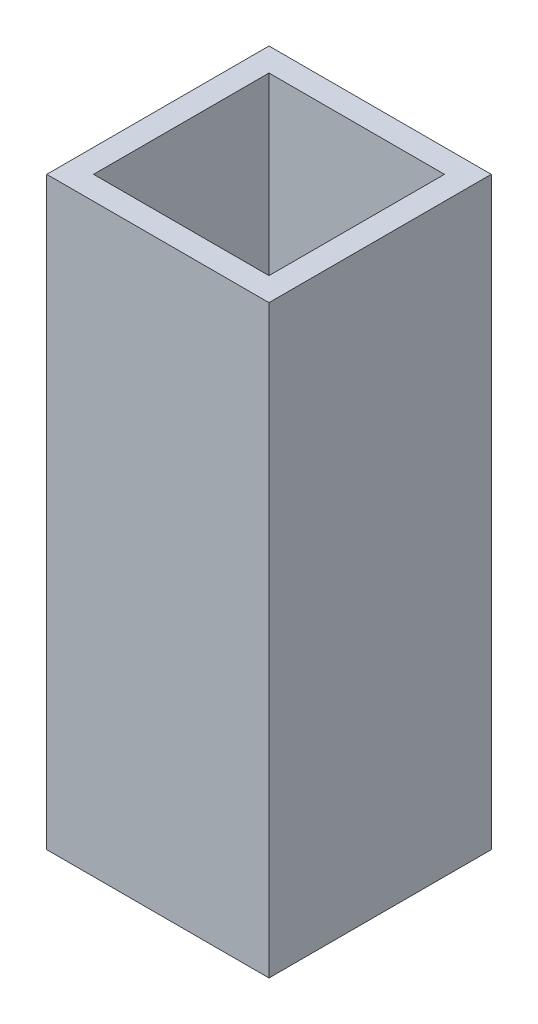
ISO-10303-21;
HEADER;
FILE_DESCRIPTION(('STEP AP214'),'2;1');
FILE_NAME('part.step','',(''),(''),'','','');
FILE_SCHEMA(('AUTOMOTIVE_DESIGN { 1 0 10303 214 1 1 1 1 }'));
ENDSEC;
DATA;
#1=APPLICATION_CONTEXT('core data for automotive mechanical design processes');
#2=APPLICATION_PROTOCOL_DEFINITION('international standard','automotive_design',2000,#1);
#3=PRODUCT_CONTEXT('',#1,'mechanical');
#4=PRODUCT('Part','Part','',(#3));
#5=PRODUCT_RELATED_PRODUCT_CATEGORY('part','',(#4));
#6=PRODUCT_DEFINITION_FORMATION('','',#4);
#7=PRODUCT_DEFINITION_CONTEXT('part definition',#1,'design');
#8=PRODUCT_DEFINITION('design','',#6,#7);
#9=PRODUCT_DEFINITION_SHAPE('','',#8);
#10=(LENGTH_UNIT() NAMED_UNIT(*) SI_UNIT(.MILLI.,.METRE.));
#11=(NAMED_UNIT(*) PLANE_ANGLE_UNIT() SI_UNIT($,.RADIAN.));
#12=(NAMED_UNIT(*) SI_UNIT($,.STERADIAN.) SOLID_ANGLE_UNIT());
#13=UNCERTAINTY_MEASURE_WITH_UNIT(LENGTH_MEASURE(1.E-05),#10,'distance_accuracy_value','');
#14=(GEOMETRIC_REPRESENTATION_CONTEXT(3) GLOBAL_UNCERTAINTY_ASSIGNED_CONTEXT((#13)) GLOBAL_UNIT_ASSIGNED_CONTEXT((#10,
#11,#12)) REPRESENTATION_CONTEXT('',''));
#15=CARTESIAN_POINT('',(0.,0.,0.));
#16=DIRECTION('',(0.,0.,1.));
#17=DIRECTION('',(1.,0.,0.));
#18=AXIS2_PLACEMENT_3D('',#15,#16,#17);
#19=CARTESIAN_POINT('',(0.,50.,0.));
#20=DIRECTION('',(0.,1.,0.));
#21=DIRECTION('',(0.,0.,1.));
#22=AXIS2_PLACEMENT_3D('',#19,#20,#21);
#23=PLANE('',#22);
#24=DIRECTION('',(0.,0.,-1.));
#25=VECTOR('',#24,1.);
#26=CARTESIAN_POINT('',(9.5,50.,9.5));
#27=LINE('',#26,#25);
#28=CARTESIAN_POINT('',(9.5,50.,9.5));
#29=VERTEX_POINT('',#28);
#30=CARTESIAN_POINT('',(9.5,50.,-9.5));
#31=VERTEX_POINT('',#30);
#32=EDGE_CURVE('E162',#29,#31,#27,.T.);
#33=ORIENTED_EDGE('',*,*,#32,.T.);
#34=DIRECTION('',(-1.,0.,0.));
#35=VECTOR('',#34,1.);
#36=CARTESIAN_POINT('',(-9.5,50.,-9.5));
#37=LINE('',#36,#35);
#38=CARTESIAN_POINT('',(-9.5,50.,-9.5));
#39=VERTEX_POINT('',#38);
#40=EDGE_CURVE('E165',#31,#39,#37,.T.);
#41=ORIENTED_EDGE('',*,*,#40,.T.);
#42=DIRECTION('',(0.,0.,1.));
#43=VECTOR('',#42,1.);
#44=CARTESIAN_POINT('',(-9.5,50.,9.5));
#45=LINE('',#44,#43);
#46=CARTESIAN_POINT('',(-9.5,50.,9.5));
#47=VERTEX_POINT('',#46);
#48=EDGE_CURVE('E168',#39,#47,#45,.T.);
#49=ORIENTED_EDGE('',*,*,#48,.T.);
#50=DIRECTION('',(1.,0.,0.));
#51=VECTOR('',#50,1.);
#52=CARTESIAN_POINT('',(-9.5,50.,9.5));
#53=LINE('',#52,#51);
#54=EDGE_CURVE('E170',#47,#29,#53,.T.);
#55=ORIENTED_EDGE('',*,*,#54,.T.);
#56=EDGE_LOOP('',(#33,#41,#49,#55));
#57=FACE_BOUND('',#56,.T.);
#58=DIRECTION('',(-1.,0.,0.));
#59=VECTOR('',#58,1.);
#60=CARTESIAN_POINT('',(0.,50.,-7.5));
#61=LINE('',#60,#59);
#62=CARTESIAN_POINT('',(7.5,50.,-7.5));
#63=VERTEX_POINT('',#62);
#64=CARTESIAN_POINT('',(-7.5,50.,-7.5));
#65=VERTEX_POINT('',#64);
#66=EDGE_CURVE('E134',#63,#65,#61,.T.);
#67=ORIENTED_EDGE('',*,*,#66,.F.);
#68=DIRECTION('',(0.,0.,-1.));
#69=VECTOR('',#68,1.);
#70=CARTESIAN_POINT('',(7.5,50.,0.));
#71=LINE('',#70,#69);
#72=CARTESIAN_POINT('',(7.5,50.,7.5));
#73=VERTEX_POINT('',#72);
#74=EDGE_CURVE('E126',#73,#63,#71,.T.);
#75=ORIENTED_EDGE('',*,*,#74,.F.);
#76=DIRECTION('',(1.,0.,0.));
#77=VECTOR('',#76,1.);
#78=CARTESIAN_POINT('',(0.,50.,7.5));
#79=LINE('',#78,#77);
#80=CARTESIAN_POINT('',(-7.5,50.,7.5));
#81=VERTEX_POINT('',#80);
#82=EDGE_CURVE('E148',#81,#73,#79,.T.);
#83=ORIENTED_EDGE('',*,*,#82,.F.);
#84=DIRECTION('',(0.,0.,1.));
#85=VECTOR('',#84,1.);
#86=CARTESIAN_POINT('',(-7.5,50.,0.));
#87=LINE('',#86,#85);
#88=EDGE_CURVE('E146',#65,#81,#87,.T.);
#89=ORIENTED_EDGE('',*,*,#88,.F.);
#90=EDGE_LOOP('',(#67,#75,#83,#89));
#91=FACE_BOUND('',#90,.T.);
#92=ADVANCED_FACE('F61',(#57,#91),#23,.T.);
#93=CARTESIAN_POINT('',(0.,0.,0.));
#94=DIRECTION('',(0.,1.,0.));
#95=DIRECTION('',(0.,0.,1.));
#96=AXIS2_PLACEMENT_3D('',#93,#94,#95);
#97=PLANE('',#96);
#98=DIRECTION('',(0.,0.,-1.));
#99=VECTOR('',#98,1.);
#100=CARTESIAN_POINT('',(9.5,0.,9.5));
#101=LINE('',#100,#99);
#102=CARTESIAN_POINT('',(9.5,0.,9.5));
#103=VERTEX_POINT('',#102);
#104=CARTESIAN_POINT('',(9.5,0.,-9.5));
#105=VERTEX_POINT('',#104);
#106=EDGE_CURVE('E142',#103,#105,#101,.T.);
#107=ORIENTED_EDGE('',*,*,#106,.F.);
#108=DIRECTION('',(1.,0.,0.));
#109=VECTOR('',#108,1.);
#110=CARTESIAN_POINT('',(-9.5,0.,9.5));
#111=LINE('',#110,#109);
#112=CARTESIAN_POINT('',(-9.5,0.,9.5));
#113=VERTEX_POINT('',#112);
#114=EDGE_CURVE('E166',#113,#103,#111,.T.);
#115=ORIENTED_EDGE('',*,*,#114,.F.);
#116=DIRECTION('',(0.,0.,1.));
#117=VECTOR('',#116,1.);
#118=CARTESIAN_POINT('',(-9.5,0.,9.5));
#119=LINE('',#118,#117);
#120=CARTESIAN_POINT('',(-9.5,0.,-9.5));
#121=VERTEX_POINT('',#120);
#122=EDGE_CURVE('E177',#121,#113,#119,.T.);
#123=ORIENTED_EDGE('',*,*,#122,.F.);
#124=DIRECTION('',(-1.,0.,0.));
#125=VECTOR('',#124,1.);
#126=CARTESIAN_POINT('',(-9.5,0.,-9.5));
#127=LINE('',#126,#125);
#128=EDGE_CURVE('E175',#105,#121,#127,.T.);
#129=ORIENTED_EDGE('',*,*,#128,.F.);
#130=EDGE_LOOP('',(#107,#115,#123,#129));
#131=FACE_BOUND('',#130,.T.);
#132=DIRECTION('',(0.,0.,-1.));
#133=VECTOR('',#132,1.);
#134=CARTESIAN_POINT('',(7.5,0.,0.));
#135=LINE('',#134,#133);
#136=CARTESIAN_POINT('',(7.5,0.,7.5));
#137=VERTEX_POINT('',#136);
#138=CARTESIAN_POINT('',(7.5,0.,-7.5));
#139=VERTEX_POINT('',#138);
#140=EDGE_CURVE('E84',#137,#139,#135,.T.);
#141=ORIENTED_EDGE('',*,*,#140,.T.);
#142=DIRECTION('',(-1.,0.,0.));
#143=VECTOR('',#142,1.);
#144=CARTESIAN_POINT('',(0.,0.,-7.5));
#145=LINE('',#144,#143);
#146=CARTESIAN_POINT('',(-7.5,0.,-7.5));
#147=VERTEX_POINT('',#146);
#148=EDGE_CURVE('E141',#139,#147,#145,.T.);
#149=ORIENTED_EDGE('',*,*,#148,.T.);
#150=DIRECTION('',(0.,0.,1.));
#151=VECTOR('',#150,1.);
#152=CARTESIAN_POINT('',(-7.5,0.,0.));
#153=LINE('',#152,#151);
#154=CARTESIAN_POINT('',(-7.5,0.,7.5));
#155=VERTEX_POINT('',#154);
#156=EDGE_CURVE('E154',#147,#155,#153,.T.);
#157=ORIENTED_EDGE('',*,*,#156,.T.);
#158=DIRECTION('',(1.,0.,0.));
#159=VECTOR('',#158,1.);
#160=CARTESIAN_POINT('',(0.,0.,7.5));
#161=LINE('',#160,#159);
#162=EDGE_CURVE('E135',#155,#137,#161,.T.);
#163=ORIENTED_EDGE('',*,*,#162,.T.);
#164=EDGE_LOOP('',(#141,#149,#157,#163));
#165=FACE_BOUND('',#164,.T.);
#166=ADVANCED_FACE('F195',(#131,#165),#97,.F.);
#167=CARTESIAN_POINT('',(9.5,50.,9.5));
#168=DIRECTION('',(-1.,0.,0.));
#169=DIRECTION('',(0.,0.,1.));
#170=AXIS2_PLACEMENT_3D('',#167,#168,#169);
#171=PLANE('',#170);
#172=ORIENTED_EDGE('',*,*,#106,.T.);
#173=DIRECTION('',(0.,-1.,0.));
#174=VECTOR('',#173,1.);
#175=CARTESIAN_POINT('',(9.5,50.,-9.5));
#176=LINE('',#175,#174);
#177=EDGE_CURVE('E12',#31,#105,#176,.T.);
#178=ORIENTED_EDGE('',*,*,#177,.F.);
#179=ORIENTED_EDGE('',*,*,#32,.F.);
#180=DIRECTION('',(0.,-1.,0.));
#181=VECTOR('',#180,1.);
#182=CARTESIAN_POINT('',(9.5,50.,9.5));
#183=LINE('',#182,#181);
#184=EDGE_CURVE('E172',#29,#103,#183,.T.);
#185=ORIENTED_EDGE('',*,*,#184,.T.);
#186=EDGE_LOOP('',(#172,#178,#179,#185));
#187=FACE_BOUND('',#186,.T.);
#188=ADVANCED_FACE('F63',(#187),#171,.F.);
#189=CARTESIAN_POINT('',(-9.5,50.,-9.5));
#190=DIRECTION('',(0.,0.,1.));
#191=DIRECTION('',(1.,0.,0.));
#192=AXIS2_PLACEMENT_3D('',#189,#190,#191);
#193=PLANE('',#192);
#194=ORIENTED_EDGE('',*,*,#128,.T.);
#195=DIRECTION('',(0.,-1.,0.));
#196=VECTOR('',#195,1.);
#197=CARTESIAN_POINT('',(-9.5,50.,-9.5));
#198=LINE('',#197,#196);
#199=EDGE_CURVE('E69',#39,#121,#198,.T.);
#200=ORIENTED_EDGE('',*,*,#199,.F.);
#201=ORIENTED_EDGE('',*,*,#40,.F.);
#202=ORIENTED_EDGE('',*,*,#177,.T.);
#203=EDGE_LOOP('',(#194,#200,#201,#202));
#204=FACE_BOUND('',#203,.T.);
#205=ADVANCED_FACE('F205',(#204),#193,.F.);
#206=CARTESIAN_POINT('',(-9.5,50.,9.5));
#207=DIRECTION('',(1.,0.,0.));
#208=DIRECTION('',(0.,0.,-1.));
#209=AXIS2_PLACEMENT_3D('',#206,#207,#208);
#210=PLANE('',#209);
#211=ORIENTED_EDGE('',*,*,#122,.T.);
#212=DIRECTION('',(0.,-1.,0.));
#213=VECTOR('',#212,1.);
#214=CARTESIAN_POINT('',(-9.5,50.,9.5));
#215=LINE('',#214,#213);
#216=EDGE_CURVE('E182',#47,#113,#215,.T.);
#217=ORIENTED_EDGE('',*,*,#216,.F.);
#218=ORIENTED_EDGE('',*,*,#48,.F.);
#219=ORIENTED_EDGE('',*,*,#199,.T.);
#220=EDGE_LOOP('',(#211,#217,#218,#219));
#221=FACE_BOUND('',#220,.T.);
#222=ADVANCED_FACE('F189',(#221),#210,.F.);
#223=CARTESIAN_POINT('',(-9.5,50.,9.5));
#224=DIRECTION('',(0.,0.,-1.));
#225=DIRECTION('',(-1.,0.,0.));
#226=AXIS2_PLACEMENT_3D('',#223,#224,#225);
#227=PLANE('',#226);
#228=ORIENTED_EDGE('',*,*,#114,.T.);
#229=ORIENTED_EDGE('',*,*,#184,.F.);
#230=ORIENTED_EDGE('',*,*,#54,.F.);
#231=ORIENTED_EDGE('',*,*,#216,.T.);
#232=EDGE_LOOP('',(#228,#229,#230,#231));
#233=FACE_BOUND('',#232,.T.);
#234=ADVANCED_FACE('F199',(#233),#227,.F.);
#235=CARTESIAN_POINT('',(7.5,50.,0.));
#236=DIRECTION('',(-1.,0.,0.));
#237=DIRECTION('',(0.,0.,1.));
#238=AXIS2_PLACEMENT_3D('',#235,#236,#237);
#239=PLANE('',#238);
#240=ORIENTED_EDGE('',*,*,#140,.F.);
#241=DIRECTION('',(0.,-1.,0.));
#242=VECTOR('',#241,1.);
#243=CARTESIAN_POINT('',(7.5,50.,7.5));
#244=LINE('',#243,#242);
#245=EDGE_CURVE('E130',#73,#137,#244,.T.);
#246=ORIENTED_EDGE('',*,*,#245,.F.);
#247=ORIENTED_EDGE('',*,*,#74,.T.);
#248=DIRECTION('',(0.,-1.,0.));
#249=VECTOR('',#248,1.);
#250=CARTESIAN_POINT('',(7.5,50.,-7.5));
#251=LINE('',#250,#249);
#252=EDGE_CURVE('E129',#63,#139,#251,.T.);
#253=ORIENTED_EDGE('',*,*,#252,.T.);
#254=EDGE_LOOP('',(#240,#246,#247,#253));
#255=FACE_BOUND('',#254,.T.);
#256=ADVANCED_FACE('F128',(#255),#239,.T.);
#257=CARTESIAN_POINT('',(0.,50.,-7.5));
#258=DIRECTION('',(0.,0.,1.));
#259=DIRECTION('',(1.,0.,0.));
#260=AXIS2_PLACEMENT_3D('',#257,#258,#259);
#261=PLANE('',#260);
#262=ORIENTED_EDGE('',*,*,#148,.F.);
#263=ORIENTED_EDGE('',*,*,#252,.F.);
#264=ORIENTED_EDGE('',*,*,#66,.T.);
#265=DIRECTION('',(0.,-1.,0.));
#266=VECTOR('',#265,1.);
#267=CARTESIAN_POINT('',(-7.5,50.,-7.5));
#268=LINE('',#267,#266);
#269=EDGE_CURVE('E143',#65,#147,#268,.T.);
#270=ORIENTED_EDGE('',*,*,#269,.T.);
#271=EDGE_LOOP('',(#262,#263,#264,#270));
#272=FACE_BOUND('',#271,.T.);
#273=ADVANCED_FACE('F138',(#272),#261,.T.);
#274=CARTESIAN_POINT('',(-7.5,50.,0.));
#275=DIRECTION('',(1.,0.,0.));
#276=DIRECTION('',(0.,0.,-1.));
#277=AXIS2_PLACEMENT_3D('',#274,#275,#276);
#278=PLANE('',#277);
#279=ORIENTED_EDGE('',*,*,#156,.F.);
#280=ORIENTED_EDGE('',*,*,#269,.F.);
#281=ORIENTED_EDGE('',*,*,#88,.T.);
#282=DIRECTION('',(0.,-1.,0.));
#283=VECTOR('',#282,1.);
#284=CARTESIAN_POINT('',(-7.5,50.,7.5));
#285=LINE('',#284,#283);
#286=EDGE_CURVE('E76',#81,#155,#285,.T.);
#287=ORIENTED_EDGE('',*,*,#286,.T.);
#288=EDGE_LOOP('',(#279,#280,#281,#287));
#289=FACE_BOUND('',#288,.T.);
#290=ADVANCED_FACE('F228',(#289),#278,.T.);
#291=CARTESIAN_POINT('',(0.,50.,7.5));
#292=DIRECTION('',(0.,0.,-1.));
#293=DIRECTION('',(-1.,0.,0.));
#294=AXIS2_PLACEMENT_3D('',#291,#292,#293);
#295=PLANE('',#294);
#296=ORIENTED_EDGE('',*,*,#162,.F.);
#297=ORIENTED_EDGE('',*,*,#286,.F.);
#298=ORIENTED_EDGE('',*,*,#82,.T.);
#299=ORIENTED_EDGE('',*,*,#245,.T.);
#300=EDGE_LOOP('',(#296,#297,#298,#299));
#301=FACE_BOUND('',#300,.T.);
#302=ADVANCED_FACE('F232',(#301),#295,.T.);
#303=CLOSED_SHELL('',(#92,#166,#188,#205,#222,#234,#256,#273,#290,#302));
#304=MANIFOLD_SOLID_BREP('B2',#303);
#305=ADVANCED_BREP_SHAPE_REPRESENTATION('',(#18,#304),#14);
#306=SHAPE_DEFINITION_REPRESENTATION(#9,#305);
ENDSEC;
END-ISO-10303-21;
